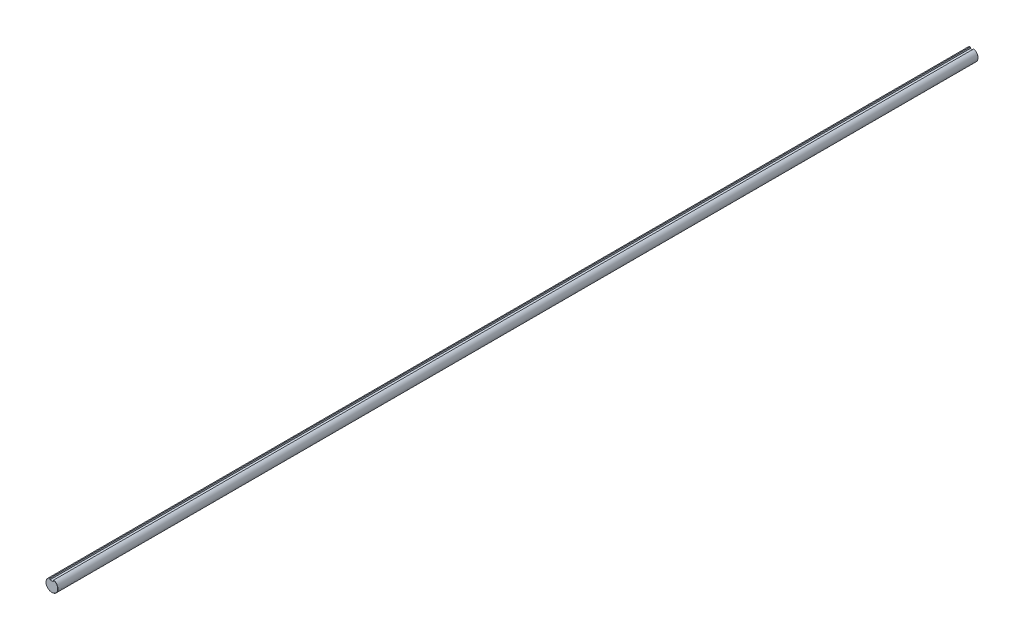
ISO-10303-21;
HEADER;
FILE_DESCRIPTION(('STEP AP214'),'2;1');
FILE_NAME('part.step','',(''),(''),'','','');
FILE_SCHEMA(('AUTOMOTIVE_DESIGN { 1 0 10303 214 1 1 1 1 }'));
ENDSEC;
DATA;
#1=APPLICATION_CONTEXT('core data for automotive mechanical design processes');
#2=APPLICATION_PROTOCOL_DEFINITION('international standard','automotive_design',2000,#1);
#3=PRODUCT_CONTEXT('',#1,'mechanical');
#4=PRODUCT('Part','Part','',(#3));
#5=PRODUCT_RELATED_PRODUCT_CATEGORY('part','',(#4));
#6=PRODUCT_DEFINITION_FORMATION('','',#4);
#7=PRODUCT_DEFINITION_CONTEXT('part definition',#1,'design');
#8=PRODUCT_DEFINITION('design','',#6,#7);
#9=PRODUCT_DEFINITION_SHAPE('','',#8);
#10=(LENGTH_UNIT() NAMED_UNIT(*) SI_UNIT(.MILLI.,.METRE.));
#11=(NAMED_UNIT(*) PLANE_ANGLE_UNIT() SI_UNIT($,.RADIAN.));
#12=(NAMED_UNIT(*) SI_UNIT($,.STERADIAN.) SOLID_ANGLE_UNIT());
#13=UNCERTAINTY_MEASURE_WITH_UNIT(LENGTH_MEASURE(1.E-05),#10,'distance_accuracy_value','');
#14=(GEOMETRIC_REPRESENTATION_CONTEXT(3) GLOBAL_UNCERTAINTY_ASSIGNED_CONTEXT((#13)) GLOBAL_UNIT_ASSIGNED_CONTEXT((#10,
#11,#12)) REPRESENTATION_CONTEXT('',''));
#15=CARTESIAN_POINT('',(0.,0.,0.));
#16=DIRECTION('',(0.,0.,1.));
#17=DIRECTION('',(1.,0.,0.));
#18=AXIS2_PLACEMENT_3D('',#15,#16,#17);
#19=CARTESIAN_POINT('',(0.,0.,304.8));
#20=DIRECTION('',(0.,0.,-1.));
#21=DIRECTION('',(-1.,0.,0.));
#22=AXIS2_PLACEMENT_3D('',#19,#20,#21);
#23=CYLINDRICAL_SURFACE('',#22,3.96874999999999);
#24=DIRECTION('',(0.,0.,-1.));
#25=VECTOR('',#24,1.);
#26=CARTESIAN_POINT('',(-1.1938,3.78494625093936,304.8));
#27=LINE('',#26,#25);
#28=CARTESIAN_POINT('',(-1.1938,3.78494625093936,304.720625));
#29=VERTEX_POINT('',#28);
#30=CARTESIAN_POINT('',(-1.1938,3.78494625093936,-304.720624999999));
#31=VERTEX_POINT('',#30);
#32=EDGE_CURVE('E118',#29,#31,#27,.T.);
#33=ORIENTED_EDGE('',*,*,#32,.T.);
#34=CARTESIAN_POINT('',(0.,0.,-304.720624999999));
#35=DIRECTION('',(0.,0.,1.));
#36=DIRECTION('',(1.,0.,0.));
#37=AXIS2_PLACEMENT_3D('',#34,#35,#36);
#38=CIRCLE('',#37,3.96874999999999);
#39=CARTESIAN_POINT('',(1.1938,3.78494625093936,-304.720624999999));
#40=VERTEX_POINT('',#39);
#41=EDGE_CURVE('E125',#31,#40,#38,.T.);
#42=ORIENTED_EDGE('',*,*,#41,.T.);
#43=DIRECTION('',(0.,0.,-1.));
#44=VECTOR('',#43,1.);
#45=CARTESIAN_POINT('',(1.1938,3.78494625093936,304.8));
#46=LINE('',#45,#44);
#47=CARTESIAN_POINT('',(1.1938,3.78494625093936,304.720625));
#48=VERTEX_POINT('',#47);
#49=EDGE_CURVE('E105',#48,#40,#46,.T.);
#50=ORIENTED_EDGE('',*,*,#49,.F.);
#51=CARTESIAN_POINT('',(0.,0.,304.720625));
#52=DIRECTION('',(0.,0.,1.));
#53=DIRECTION('',(1.,0.,0.));
#54=AXIS2_PLACEMENT_3D('',#51,#52,#53);
#55=CIRCLE('',#54,3.96874999999999);
#56=EDGE_CURVE('E123',#48,#29,#55,.F.);
#57=ORIENTED_EDGE('',*,*,#56,.T.);
#58=EDGE_LOOP('',(#33,#42,#50,#57));
#59=FACE_BOUND('',#58,.T.);
#60=ADVANCED_FACE('F32',(#59),#23,.T.);
#61=CARTESIAN_POINT('',(1.1938,2.77494999999999,304.8));
#62=DIRECTION('',(1.,0.,0.));
#63=DIRECTION('',(0.,0.,-1.));
#64=AXIS2_PLACEMENT_3D('',#61,#62,#63);
#65=PLANE('',#64);
#66=ORIENTED_EDGE('',*,*,#49,.T.);
#67=CARTESIAN_POINT('',(1.1938,3.78494625093936,-304.720624999999));
#68=CARTESIAN_POINT('',(1.1938,3.7710673305065,-304.733861291887));
#69=CARTESIAN_POINT('',(1.1938,3.75718501590561,-304.747094021161));
#70=CARTESIAN_POINT('',(1.1938,3.7294135983493,-304.773552354494));
#71=CARTESIAN_POINT('',(1.1938,3.71552449539386,-304.786777958555));
#72=CARTESIAN_POINT('',(1.1938,3.70163199827038,-304.8));
#73=B_SPLINE_CURVE_WITH_KNOTS('',3,(#67,#68,#69,#70,#71,#72),.UNSPECIFIED.,.F.,.F.,(4,2,4),(0.,
0.0575361976866607,0.11507239544985),.UNSPECIFIED.);
#74=CARTESIAN_POINT('',(1.1938,3.70163199827038,-304.8));
#75=VERTEX_POINT('',#74);
#76=EDGE_CURVE('E96',#40,#75,#73,.T.);
#77=ORIENTED_EDGE('',*,*,#76,.T.);
#78=DIRECTION('',(0.,-1.,0.));
#79=VECTOR('',#78,1.);
#80=CARTESIAN_POINT('',(1.1938,2.77494999999999,-304.8));
#81=LINE('',#80,#79);
#82=CARTESIAN_POINT('',(1.1938,2.77494999999999,-304.8));
#83=VERTEX_POINT('',#82);
#84=EDGE_CURVE('E89',#75,#83,#81,.T.);
#85=ORIENTED_EDGE('',*,*,#84,.T.);
#86=DIRECTION('',(0.,0.,-1.));
#87=VECTOR('',#86,1.);
#88=CARTESIAN_POINT('',(1.1938,2.77494999999999,304.8));
#89=LINE('',#88,#87);
#90=CARTESIAN_POINT('',(1.1938,2.77494999999999,304.8));
#91=VERTEX_POINT('',#90);
#92=EDGE_CURVE('E94',#91,#83,#89,.T.);
#93=ORIENTED_EDGE('',*,*,#92,.F.);
#94=DIRECTION('',(0.,-1.,0.));
#95=VECTOR('',#94,1.);
#96=CARTESIAN_POINT('',(1.1938,2.77494999999999,304.8));
#97=LINE('',#96,#95);
#98=CARTESIAN_POINT('',(1.1938,3.70163199827137,304.8));
#99=VERTEX_POINT('',#98);
#100=EDGE_CURVE('E111',#99,#91,#97,.T.);
#101=ORIENTED_EDGE('',*,*,#100,.F.);
#102=CARTESIAN_POINT('',(1.1938,3.70163199827137,304.8));
#103=CARTESIAN_POINT('',(1.1938,3.71552449539468,304.786777958555));
#104=CARTESIAN_POINT('',(1.1938,3.72941359834995,304.773552354494));
#105=CARTESIAN_POINT('',(1.1938,3.75718501590594,304.747094021161));
#106=CARTESIAN_POINT('',(1.1938,3.77106733050667,304.733861291888));
#107=CARTESIAN_POINT('',(1.1938,3.78494625093937,304.720625));
#108=B_SPLINE_CURVE_WITH_KNOTS('',3,(#102,#103,#104,#105,#106,#107),.UNSPECIFIED.,.F.,.F.,(4,2,
4),(0.,0.0575361977624766,0.115072395448487),.UNSPECIFIED.);
#109=EDGE_CURVE('E128',#99,#48,#108,.T.);
#110=ORIENTED_EDGE('',*,*,#109,.T.);
#111=EDGE_LOOP('',(#66,#77,#85,#93,#101,#110));
#112=FACE_BOUND('',#111,.T.);
#113=ADVANCED_FACE('F92',(#112),#65,.F.);
#114=CARTESIAN_POINT('',(1.1938,2.77494999999999,304.8));
#115=DIRECTION('',(0.,-1.,0.));
#116=DIRECTION('',(0.,0.,-1.));
#117=AXIS2_PLACEMENT_3D('',#114,#115,#116);
#118=PLANE('',#117);
#119=ORIENTED_EDGE('',*,*,#92,.T.);
#120=DIRECTION('',(-1.,0.,0.));
#121=VECTOR('',#120,1.);
#122=CARTESIAN_POINT('',(1.1938,2.77494999999999,-304.8));
#123=LINE('',#122,#121);
#124=CARTESIAN_POINT('',(-1.1938,2.77494999999999,-304.8));
#125=VERTEX_POINT('',#124);
#126=EDGE_CURVE('E98',#83,#125,#123,.T.);
#127=ORIENTED_EDGE('',*,*,#126,.T.);
#128=DIRECTION('',(0.,0.,-1.));
#129=VECTOR('',#128,1.);
#130=CARTESIAN_POINT('',(-1.1938,2.77494999999999,304.8));
#131=LINE('',#130,#129);
#132=CARTESIAN_POINT('',(-1.1938,2.77494999999999,304.8));
#133=VERTEX_POINT('',#132);
#134=EDGE_CURVE('E106',#133,#125,#131,.T.);
#135=ORIENTED_EDGE('',*,*,#134,.F.);
#136=DIRECTION('',(-1.,0.,0.));
#137=VECTOR('',#136,1.);
#138=CARTESIAN_POINT('',(1.1938,2.77494999999999,304.8));
#139=LINE('',#138,#137);
#140=EDGE_CURVE('E104',#91,#133,#139,.T.);
#141=ORIENTED_EDGE('',*,*,#140,.F.);
#142=EDGE_LOOP('',(#119,#127,#135,#141));
#143=FACE_BOUND('',#142,.T.);
#144=ADVANCED_FACE('F102',(#143),#118,.F.);
#145=CARTESIAN_POINT('',(-1.1938,2.77494999999999,304.8));
#146=DIRECTION('',(-1.,0.,0.));
#147=DIRECTION('',(0.,0.,1.));
#148=AXIS2_PLACEMENT_3D('',#145,#146,#147);
#149=PLANE('',#148);
#150=DIRECTION('',(0.,1.,0.));
#151=VECTOR('',#150,1.);
#152=CARTESIAN_POINT('',(-1.1938,2.77494999999999,-304.8));
#153=LINE('',#152,#151);
#154=CARTESIAN_POINT('',(-1.1938,3.70163199827038,-304.8));
#155=VERTEX_POINT('',#154);
#156=EDGE_CURVE('E109',#125,#155,#153,.T.);
#157=ORIENTED_EDGE('',*,*,#156,.T.);
#158=CARTESIAN_POINT('',(-1.1938,3.70163199827038,-304.8));
#159=CARTESIAN_POINT('',(-1.1938,3.71552449539386,-304.786777958555));
#160=CARTESIAN_POINT('',(-1.1938,3.7294135983493,-304.773552354494));
#161=CARTESIAN_POINT('',(-1.1938,3.75718501590562,-304.747094021161));
#162=CARTESIAN_POINT('',(-1.1938,3.77106733050651,-304.733861291887));
#163=CARTESIAN_POINT('',(-1.1938,3.78494625093937,-304.720624999999));
#164=B_SPLINE_CURVE_WITH_KNOTS('',3,(#158,#159,#160,#161,#162,#163),.UNSPECIFIED.,.F.,.F.,(4,2,
4),(0.,0.0575361977631901,0.115072395449857),.UNSPECIFIED.);
#165=EDGE_CURVE('E41',#155,#31,#164,.T.);
#166=ORIENTED_EDGE('',*,*,#165,.T.);
#167=ORIENTED_EDGE('',*,*,#32,.F.);
#168=CARTESIAN_POINT('',(-1.1938,3.78494625093936,304.720625));
#169=CARTESIAN_POINT('',(-1.1938,3.77106733050667,304.733861291888));
#170=CARTESIAN_POINT('',(-1.1938,3.75718501590594,304.747094021161));
#171=CARTESIAN_POINT('',(-1.1938,3.72941359834995,304.773552354494));
#172=CARTESIAN_POINT('',(-1.1938,3.71552449539468,304.786777958555));
#173=CARTESIAN_POINT('',(-1.1938,3.70163199827137,304.8));
#174=B_SPLINE_CURVE_WITH_KNOTS('',3,(#168,#169,#170,#171,#172,#173),.UNSPECIFIED.,.F.,.F.,(4,2,
4),(0.,0.0575361976860056,0.115072395448481),.UNSPECIFIED.);
#175=CARTESIAN_POINT('',(-1.1938,3.70163199827137,304.8));
#176=VERTEX_POINT('',#175);
#177=EDGE_CURVE('E48',#29,#176,#174,.T.);
#178=ORIENTED_EDGE('',*,*,#177,.T.);
#179=DIRECTION('',(0.,1.,0.));
#180=VECTOR('',#179,1.);
#181=CARTESIAN_POINT('',(-1.1938,2.77494999999999,304.8));
#182=LINE('',#181,#180);
#183=EDGE_CURVE('E116',#133,#176,#182,.T.);
#184=ORIENTED_EDGE('',*,*,#183,.F.);
#185=ORIENTED_EDGE('',*,*,#134,.T.);
#186=EDGE_LOOP('',(#157,#166,#167,#178,#184,#185));
#187=FACE_BOUND('',#186,.T.);
#188=ADVANCED_FACE('F158',(#187),#149,.F.);
#189=CARTESIAN_POINT('',(0.,0.,304.8));
#190=DIRECTION('',(0.,0.,1.));
#191=DIRECTION('',(1.,0.,0.));
#192=AXIS2_PLACEMENT_3D('',#189,#190,#191);
#193=PLANE('',#192);
#194=ORIENTED_EDGE('',*,*,#183,.T.);
#195=CARTESIAN_POINT('',(0.,0.,304.8));
#196=DIRECTION('',(0.,0.,1.));
#197=DIRECTION('',(1.,0.,0.));
#198=AXIS2_PLACEMENT_3D('',#195,#196,#197);
#199=CIRCLE('',#198,3.88937500000019);
#200=EDGE_CURVE('E11',#176,#99,#199,.T.);
#201=ORIENTED_EDGE('',*,*,#200,.T.);
#202=ORIENTED_EDGE('',*,*,#100,.T.);
#203=ORIENTED_EDGE('',*,*,#140,.T.);
#204=EDGE_LOOP('',(#194,#201,#202,#203));
#205=FACE_BOUND('',#204,.T.);
#206=ADVANCED_FACE('F162',(#205),#193,.T.);
#207=CARTESIAN_POINT('',(0.,0.,-304.8));
#208=DIRECTION('',(0.,0.,1.));
#209=DIRECTION('',(1.,0.,0.));
#210=AXIS2_PLACEMENT_3D('',#207,#208,#209);
#211=PLANE('',#210);
#212=ORIENTED_EDGE('',*,*,#84,.F.);
#213=CARTESIAN_POINT('',(0.,0.,-304.8));
#214=DIRECTION('',(0.,0.,1.));
#215=DIRECTION('',(1.,0.,0.));
#216=AXIS2_PLACEMENT_3D('',#213,#214,#215);
#217=CIRCLE('',#216,3.88937499999925);
#218=EDGE_CURVE('E56',#75,#155,#217,.F.);
#219=ORIENTED_EDGE('',*,*,#218,.T.);
#220=ORIENTED_EDGE('',*,*,#156,.F.);
#221=ORIENTED_EDGE('',*,*,#126,.F.);
#222=EDGE_LOOP('',(#212,#219,#220,#221));
#223=FACE_BOUND('',#222,.T.);
#224=ADVANCED_FACE('F108',(#223),#211,.F.);
#225=CARTESIAN_POINT('',(0.,0.,-304.720624999999));
#226=DIRECTION('',(0.,0.,1.));
#227=DIRECTION('',(1.,0.,0.));
#228=AXIS2_PLACEMENT_3D('',#225,#226,#227);
#229=CONICAL_SURFACE('',#228,3.96874999999999,0.785398163397246);
#230=ORIENTED_EDGE('',*,*,#165,.F.);
#231=ORIENTED_EDGE('',*,*,#218,.F.);
#232=ORIENTED_EDGE('',*,*,#76,.F.);
#233=ORIENTED_EDGE('',*,*,#41,.F.);
#234=EDGE_LOOP('',(#230,#231,#232,#233));
#235=FACE_BOUND('',#234,.T.);
#236=ADVANCED_FACE('F146',(#235),#229,.T.);
#237=CARTESIAN_POINT('',(0.,0.,304.8));
#238=DIRECTION('',(0.,0.,-1.));
#239=DIRECTION('',(-1.,0.,0.));
#240=AXIS2_PLACEMENT_3D('',#237,#238,#239);
#241=CONICAL_SURFACE('',#240,3.88937500000019,0.785398163397246);
#242=ORIENTED_EDGE('',*,*,#177,.F.);
#243=ORIENTED_EDGE('',*,*,#56,.F.);
#244=ORIENTED_EDGE('',*,*,#109,.F.);
#245=ORIENTED_EDGE('',*,*,#200,.F.);
#246=EDGE_LOOP('',(#242,#243,#244,#245));
#247=FACE_BOUND('',#246,.T.);
#248=ADVANCED_FACE('F34',(#247),#241,.T.);
#249=CLOSED_SHELL('',(#60,#113,#144,#188,#206,#224,#236,#248));
#250=MANIFOLD_SOLID_BREP('B2',#249);
#251=ADVANCED_BREP_SHAPE_REPRESENTATION('',(#18,#250),#14);
#252=SHAPE_DEFINITION_REPRESENTATION(#9,#251);
ENDSEC;
END-ISO-10303-21;
